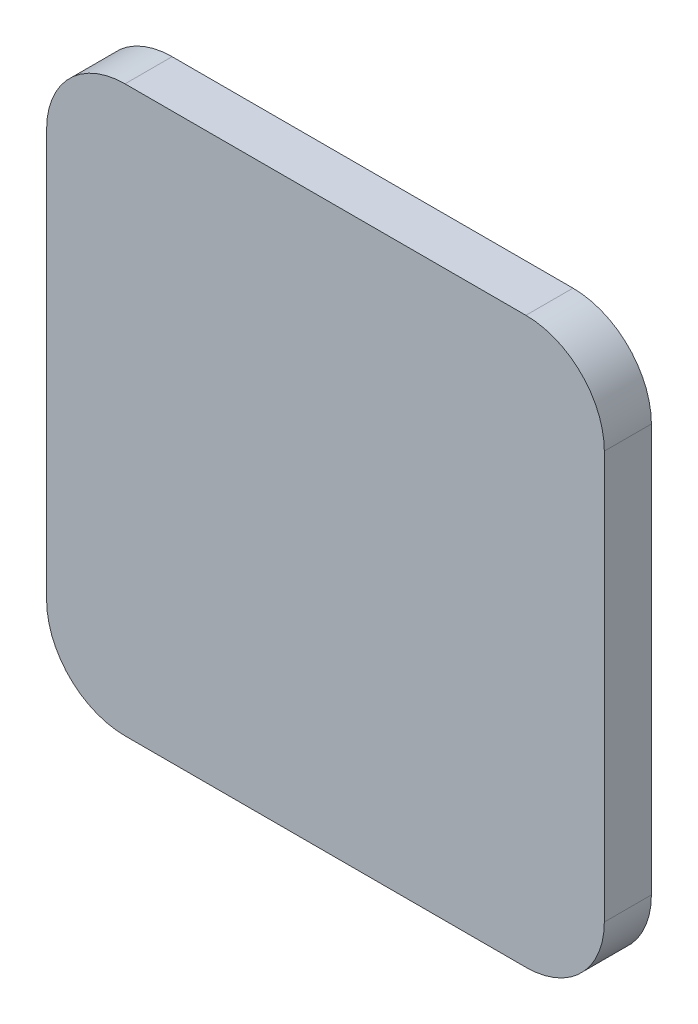
ISO-10303-21;
HEADER;
FILE_DESCRIPTION(('STEP AP214'),'2;1');
FILE_NAME('part.step','',(''),(''),'','','');
FILE_SCHEMA(('AUTOMOTIVE_DESIGN { 1 0 10303 214 1 1 1 1 }'));
ENDSEC;
DATA;
#1=APPLICATION_CONTEXT('core data for automotive mechanical design processes');
#2=APPLICATION_PROTOCOL_DEFINITION('international standard','automotive_design',2000,#1);
#3=PRODUCT_CONTEXT('',#1,'mechanical');
#4=PRODUCT('Part','Part','',(#3));
#5=PRODUCT_RELATED_PRODUCT_CATEGORY('part','',(#4));
#6=PRODUCT_DEFINITION_FORMATION('','',#4);
#7=PRODUCT_DEFINITION_CONTEXT('part definition',#1,'design');
#8=PRODUCT_DEFINITION('design','',#6,#7);
#9=PRODUCT_DEFINITION_SHAPE('','',#8);
#10=(LENGTH_UNIT() NAMED_UNIT(*) SI_UNIT(.MILLI.,.METRE.));
#11=(NAMED_UNIT(*) PLANE_ANGLE_UNIT() SI_UNIT($,.RADIAN.));
#12=(NAMED_UNIT(*) SI_UNIT($,.STERADIAN.) SOLID_ANGLE_UNIT());
#13=UNCERTAINTY_MEASURE_WITH_UNIT(LENGTH_MEASURE(1.E-05),#10,'distance_accuracy_value','');
#14=(GEOMETRIC_REPRESENTATION_CONTEXT(3) GLOBAL_UNCERTAINTY_ASSIGNED_CONTEXT((#13)) GLOBAL_UNIT_ASSIGNED_CONTEXT((#10,
#11,#12)) REPRESENTATION_CONTEXT('',''));
#15=CARTESIAN_POINT('',(0.,0.,0.));
#16=DIRECTION('',(0.,0.,1.));
#17=DIRECTION('',(1.,0.,0.));
#18=AXIS2_PLACEMENT_3D('',#15,#16,#17);
#19=CARTESIAN_POINT('',(13.,-13.,9.));
#20=DIRECTION('',(0.,0.,-1.));
#21=DIRECTION('',(-1.,0.,0.));
#22=AXIS2_PLACEMENT_3D('',#19,#20,#21);
#23=CYLINDRICAL_SURFACE('',#22,5.);
#24=CARTESIAN_POINT('',(13.,-13.,6.));
#25=DIRECTION('',(0.,0.,1.));
#26=DIRECTION('',(-1.,0.,0.));
#27=AXIS2_PLACEMENT_3D('',#24,#25,#26);
#28=CIRCLE('',#27,5.);
#29=CARTESIAN_POINT('',(13.,-18.,6.));
#30=VERTEX_POINT('',#29);
#31=CARTESIAN_POINT('',(18.,-13.,6.));
#32=VERTEX_POINT('',#31);
#33=EDGE_CURVE('E130',#30,#32,#28,.T.);
#34=ORIENTED_EDGE('',*,*,#33,.T.);
#35=DIRECTION('',(0.,0.,-1.));
#36=VECTOR('',#35,1.);
#37=CARTESIAN_POINT('',(18.,-13.,9.));
#38=LINE('',#37,#36);
#39=CARTESIAN_POINT('',(18.,-13.,9.));
#40=VERTEX_POINT('',#39);
#41=EDGE_CURVE('E11',#40,#32,#38,.T.);
#42=ORIENTED_EDGE('',*,*,#41,.F.);
#43=CARTESIAN_POINT('',(13.,-13.,9.));
#44=DIRECTION('',(0.,0.,1.));
#45=DIRECTION('',(-1.,0.,0.));
#46=AXIS2_PLACEMENT_3D('',#43,#44,#45);
#47=CIRCLE('',#46,5.);
#48=CARTESIAN_POINT('',(13.,-18.,9.));
#49=VERTEX_POINT('',#48);
#50=EDGE_CURVE('E144',#49,#40,#47,.T.);
#51=ORIENTED_EDGE('',*,*,#50,.F.);
#52=DIRECTION('',(0.,0.,-1.));
#53=VECTOR('',#52,1.);
#54=CARTESIAN_POINT('',(13.,-18.,9.));
#55=LINE('',#54,#53);
#56=EDGE_CURVE('E126',#49,#30,#55,.T.);
#57=ORIENTED_EDGE('',*,*,#56,.T.);
#58=EDGE_LOOP('',(#34,#42,#51,#57));
#59=FACE_BOUND('',#58,.T.);
#60=ADVANCED_FACE('F34',(#59),#23,.T.);
#61=CARTESIAN_POINT('',(18.,13.,9.));
#62=DIRECTION('',(-1.,0.,0.));
#63=DIRECTION('',(0.,-1.,0.));
#64=AXIS2_PLACEMENT_3D('',#61,#62,#63);
#65=PLANE('',#64);
#66=DIRECTION('',(0.,1.,0.));
#67=VECTOR('',#66,1.);
#68=CARTESIAN_POINT('',(18.,13.,6.));
#69=LINE('',#68,#67);
#70=CARTESIAN_POINT('',(18.,13.,6.));
#71=VERTEX_POINT('',#70);
#72=EDGE_CURVE('E133',#32,#71,#69,.T.);
#73=ORIENTED_EDGE('',*,*,#72,.T.);
#74=DIRECTION('',(0.,0.,-1.));
#75=VECTOR('',#74,1.);
#76=CARTESIAN_POINT('',(18.,13.,9.));
#77=LINE('',#76,#75);
#78=CARTESIAN_POINT('',(18.,13.,9.));
#79=VERTEX_POINT('',#78);
#80=EDGE_CURVE('E42',#79,#71,#77,.T.);
#81=ORIENTED_EDGE('',*,*,#80,.F.);
#82=DIRECTION('',(0.,1.,0.));
#83=VECTOR('',#82,1.);
#84=CARTESIAN_POINT('',(18.,13.,9.));
#85=LINE('',#84,#83);
#86=EDGE_CURVE('E93',#40,#79,#85,.T.);
#87=ORIENTED_EDGE('',*,*,#86,.F.);
#88=ORIENTED_EDGE('',*,*,#41,.T.);
#89=EDGE_LOOP('',(#73,#81,#87,#88));
#90=FACE_BOUND('',#89,.T.);
#91=ADVANCED_FACE('F179',(#90),#65,.F.);
#92=CARTESIAN_POINT('',(13.,13.,9.));
#93=DIRECTION('',(0.,0.,-1.));
#94=DIRECTION('',(-1.,0.,0.));
#95=AXIS2_PLACEMENT_3D('',#92,#93,#94);
#96=CYLINDRICAL_SURFACE('',#95,5.);
#97=CARTESIAN_POINT('',(13.,13.,6.));
#98=DIRECTION('',(0.,0.,1.));
#99=DIRECTION('',(-1.,0.,0.));
#100=AXIS2_PLACEMENT_3D('',#97,#98,#99);
#101=CIRCLE('',#100,5.);
#102=CARTESIAN_POINT('',(13.,18.,6.));
#103=VERTEX_POINT('',#102);
#104=EDGE_CURVE('E135',#71,#103,#101,.T.);
#105=ORIENTED_EDGE('',*,*,#104,.T.);
#106=DIRECTION('',(0.,0.,-1.));
#107=VECTOR('',#106,1.);
#108=CARTESIAN_POINT('',(13.,18.,9.));
#109=LINE('',#108,#107);
#110=CARTESIAN_POINT('',(13.,18.,9.));
#111=VERTEX_POINT('',#110);
#112=EDGE_CURVE('E151',#111,#103,#109,.T.);
#113=ORIENTED_EDGE('',*,*,#112,.F.);
#114=CARTESIAN_POINT('',(13.,13.,9.));
#115=DIRECTION('',(0.,0.,1.));
#116=DIRECTION('',(-1.,0.,0.));
#117=AXIS2_PLACEMENT_3D('',#114,#115,#116);
#118=CIRCLE('',#117,5.);
#119=EDGE_CURVE('E159',#79,#111,#118,.T.);
#120=ORIENTED_EDGE('',*,*,#119,.F.);
#121=ORIENTED_EDGE('',*,*,#80,.T.);
#122=EDGE_LOOP('',(#105,#113,#120,#121));
#123=FACE_BOUND('',#122,.T.);
#124=ADVANCED_FACE('F157',(#123),#96,.T.);
#125=CARTESIAN_POINT('',(-12.5570972809424,18.,9.));
#126=DIRECTION('',(0.,-1.,0.));
#127=DIRECTION('',(0.,0.,-1.));
#128=AXIS2_PLACEMENT_3D('',#125,#126,#127);
#129=PLANE('',#128);
#130=DIRECTION('',(-1.,0.,0.));
#131=VECTOR('',#130,1.);
#132=CARTESIAN_POINT('',(-12.5570972809424,18.,6.));
#133=LINE('',#132,#131);
#134=CARTESIAN_POINT('',(-12.5570972809424,18.,6.));
#135=VERTEX_POINT('',#134);
#136=EDGE_CURVE('E137',#103,#135,#133,.T.);
#137=ORIENTED_EDGE('',*,*,#136,.T.);
#138=DIRECTION('',(0.,0.,-1.));
#139=VECTOR('',#138,1.);
#140=CARTESIAN_POINT('',(-12.5570972809424,18.,9.));
#141=LINE('',#140,#139);
#142=CARTESIAN_POINT('',(-12.5570972809424,18.,9.));
#143=VERTEX_POINT('',#142);
#144=EDGE_CURVE('E148',#143,#135,#141,.T.);
#145=ORIENTED_EDGE('',*,*,#144,.F.);
#146=DIRECTION('',(-1.,0.,0.));
#147=VECTOR('',#146,1.);
#148=CARTESIAN_POINT('',(-12.5570972809424,18.,9.));
#149=LINE('',#148,#147);
#150=EDGE_CURVE('E171',#111,#143,#149,.T.);
#151=ORIENTED_EDGE('',*,*,#150,.F.);
#152=ORIENTED_EDGE('',*,*,#112,.T.);
#153=EDGE_LOOP('',(#137,#145,#151,#152));
#154=FACE_BOUND('',#153,.T.);
#155=ADVANCED_FACE('F167',(#154),#129,.F.);
#156=CARTESIAN_POINT('',(-12.5570972809425,13.,9.));
#157=DIRECTION('',(0.,0.,-1.));
#158=DIRECTION('',(-1.,0.,0.));
#159=AXIS2_PLACEMENT_3D('',#156,#157,#158);
#160=CYLINDRICAL_SURFACE('',#159,5.);
#161=CARTESIAN_POINT('',(-12.5570972809425,13.,6.));
#162=DIRECTION('',(0.,0.,1.));
#163=DIRECTION('',(-1.,0.,0.));
#164=AXIS2_PLACEMENT_3D('',#161,#162,#163);
#165=CIRCLE('',#164,5.);
#166=CARTESIAN_POINT('',(-17.5570972809425,13.,6.));
#167=VERTEX_POINT('',#166);
#168=EDGE_CURVE('E139',#135,#167,#165,.T.);
#169=ORIENTED_EDGE('',*,*,#168,.T.);
#170=DIRECTION('',(0.,0.,-1.));
#171=VECTOR('',#170,1.);
#172=CARTESIAN_POINT('',(-17.5570972809425,13.,9.));
#173=LINE('',#172,#171);
#174=CARTESIAN_POINT('',(-17.5570972809425,13.,9.));
#175=VERTEX_POINT('',#174);
#176=EDGE_CURVE('E121',#175,#167,#173,.T.);
#177=ORIENTED_EDGE('',*,*,#176,.F.);
#178=CARTESIAN_POINT('',(-12.5570972809425,13.,9.));
#179=DIRECTION('',(0.,0.,1.));
#180=DIRECTION('',(-1.,0.,0.));
#181=AXIS2_PLACEMENT_3D('',#178,#179,#180);
#182=CIRCLE('',#181,5.);
#183=EDGE_CURVE('E112',#143,#175,#182,.T.);
#184=ORIENTED_EDGE('',*,*,#183,.F.);
#185=ORIENTED_EDGE('',*,*,#144,.T.);
#186=EDGE_LOOP('',(#169,#177,#184,#185));
#187=FACE_BOUND('',#186,.T.);
#188=ADVANCED_FACE('F170',(#187),#160,.T.);
#189=CARTESIAN_POINT('',(-17.5570972809425,13.,9.));
#190=DIRECTION('',(1.,0.,0.));
#191=DIRECTION('',(0.,1.,0.));
#192=AXIS2_PLACEMENT_3D('',#189,#190,#191);
#193=PLANE('',#192);
#194=DIRECTION('',(0.,-1.,0.));
#195=VECTOR('',#194,1.);
#196=CARTESIAN_POINT('',(-17.5570972809425,13.,6.));
#197=LINE('',#196,#195);
#198=CARTESIAN_POINT('',(-17.5570972809425,-13.,6.));
#199=VERTEX_POINT('',#198);
#200=EDGE_CURVE('E120',#167,#199,#197,.T.);
#201=ORIENTED_EDGE('',*,*,#200,.T.);
#202=DIRECTION('',(0.,0.,-1.));
#203=VECTOR('',#202,1.);
#204=CARTESIAN_POINT('',(-17.5570972809425,-13.,9.));
#205=LINE('',#204,#203);
#206=CARTESIAN_POINT('',(-17.5570972809425,-13.,9.));
#207=VERTEX_POINT('',#206);
#208=EDGE_CURVE('E117',#207,#199,#205,.T.);
#209=ORIENTED_EDGE('',*,*,#208,.F.);
#210=DIRECTION('',(0.,-1.,0.));
#211=VECTOR('',#210,1.);
#212=CARTESIAN_POINT('',(-17.5570972809425,13.,9.));
#213=LINE('',#212,#211);
#214=EDGE_CURVE('E106',#175,#207,#213,.T.);
#215=ORIENTED_EDGE('',*,*,#214,.F.);
#216=ORIENTED_EDGE('',*,*,#176,.T.);
#217=EDGE_LOOP('',(#201,#209,#215,#216));
#218=FACE_BOUND('',#217,.T.);
#219=ADVANCED_FACE('F118',(#218),#193,.F.);
#220=CARTESIAN_POINT('',(-12.5570972809425,-13.,9.));
#221=DIRECTION('',(0.,0.,-1.));
#222=DIRECTION('',(-1.,0.,0.));
#223=AXIS2_PLACEMENT_3D('',#220,#221,#222);
#224=CYLINDRICAL_SURFACE('',#223,5.);
#225=CARTESIAN_POINT('',(-12.5570972809425,-13.,6.));
#226=DIRECTION('',(0.,0.,1.));
#227=DIRECTION('',(-1.,0.,0.));
#228=AXIS2_PLACEMENT_3D('',#225,#226,#227);
#229=CIRCLE('',#228,5.);
#230=CARTESIAN_POINT('',(-12.5570972809424,-18.,6.));
#231=VERTEX_POINT('',#230);
#232=EDGE_CURVE('E79',#199,#231,#229,.T.);
#233=ORIENTED_EDGE('',*,*,#232,.T.);
#234=DIRECTION('',(0.,0.,-1.));
#235=VECTOR('',#234,1.);
#236=CARTESIAN_POINT('',(-12.5570972809424,-18.,9.));
#237=LINE('',#236,#235);
#238=CARTESIAN_POINT('',(-12.5570972809424,-18.,9.));
#239=VERTEX_POINT('',#238);
#240=EDGE_CURVE('E122',#239,#231,#237,.T.);
#241=ORIENTED_EDGE('',*,*,#240,.F.);
#242=CARTESIAN_POINT('',(-12.5570972809425,-13.,9.));
#243=DIRECTION('',(0.,0.,1.));
#244=DIRECTION('',(-1.,0.,0.));
#245=AXIS2_PLACEMENT_3D('',#242,#243,#244);
#246=CIRCLE('',#245,5.);
#247=EDGE_CURVE('E110',#207,#239,#246,.T.);
#248=ORIENTED_EDGE('',*,*,#247,.F.);
#249=ORIENTED_EDGE('',*,*,#208,.T.);
#250=EDGE_LOOP('',(#233,#241,#248,#249));
#251=FACE_BOUND('',#250,.T.);
#252=ADVANCED_FACE('F124',(#251),#224,.T.);
#253=CARTESIAN_POINT('',(-12.5570972809424,-18.,9.));
#254=DIRECTION('',(0.,1.,0.));
#255=DIRECTION('',(0.,0.,1.));
#256=AXIS2_PLACEMENT_3D('',#253,#254,#255);
#257=PLANE('',#256);
#258=DIRECTION('',(1.,0.,0.));
#259=VECTOR('',#258,1.);
#260=CARTESIAN_POINT('',(-12.5570972809424,-18.,6.));
#261=LINE('',#260,#259);
#262=EDGE_CURVE('E85',#231,#30,#261,.T.);
#263=ORIENTED_EDGE('',*,*,#262,.T.);
#264=ORIENTED_EDGE('',*,*,#56,.F.);
#265=DIRECTION('',(1.,0.,0.));
#266=VECTOR('',#265,1.);
#267=CARTESIAN_POINT('',(-12.5570972809424,-18.,9.));
#268=LINE('',#267,#266);
#269=EDGE_CURVE('E50',#239,#49,#268,.T.);
#270=ORIENTED_EDGE('',*,*,#269,.F.);
#271=ORIENTED_EDGE('',*,*,#240,.T.);
#272=EDGE_LOOP('',(#263,#264,#270,#271));
#273=FACE_BOUND('',#272,.T.);
#274=ADVANCED_FACE('F195',(#273),#257,.F.);
#275=CARTESIAN_POINT('',(13.,-13.,9.));
#276=DIRECTION('',(0.,0.,-1.));
#277=DIRECTION('',(-1.,0.,0.));
#278=AXIS2_PLACEMENT_3D('',#275,#276,#277);
#279=PLANE('',#278);
#280=ORIENTED_EDGE('',*,*,#50,.T.);
#281=ORIENTED_EDGE('',*,*,#86,.T.);
#282=ORIENTED_EDGE('',*,*,#119,.T.);
#283=ORIENTED_EDGE('',*,*,#150,.T.);
#284=ORIENTED_EDGE('',*,*,#183,.T.);
#285=ORIENTED_EDGE('',*,*,#214,.T.);
#286=ORIENTED_EDGE('',*,*,#247,.T.);
#287=ORIENTED_EDGE('',*,*,#269,.T.);
#288=EDGE_LOOP('',(#280,#281,#282,#283,#284,#285,#286,#287));
#289=FACE_BOUND('',#288,.T.);
#290=ADVANCED_FACE('F108',(#289),#279,.F.);
#291=CARTESIAN_POINT('',(13.,-13.,6.));
#292=DIRECTION('',(0.,0.,-1.));
#293=DIRECTION('',(-1.,0.,0.));
#294=AXIS2_PLACEMENT_3D('',#291,#292,#293);
#295=PLANE('',#294);
#296=ORIENTED_EDGE('',*,*,#33,.F.);
#297=ORIENTED_EDGE('',*,*,#262,.F.);
#298=ORIENTED_EDGE('',*,*,#232,.F.);
#299=ORIENTED_EDGE('',*,*,#200,.F.);
#300=ORIENTED_EDGE('',*,*,#168,.F.);
#301=ORIENTED_EDGE('',*,*,#136,.F.);
#302=ORIENTED_EDGE('',*,*,#104,.F.);
#303=ORIENTED_EDGE('',*,*,#72,.F.);
#304=EDGE_LOOP('',(#296,#297,#298,#299,#300,#301,#302,#303));
#305=FACE_BOUND('',#304,.T.);
#306=ADVANCED_FACE('F163',(#305),#295,.T.);
#307=CLOSED_SHELL('',(#60,#91,#124,#155,#188,#219,#252,#274,#290,#306));
#308=MANIFOLD_SOLID_BREP('B2',#307);
#309=ADVANCED_BREP_SHAPE_REPRESENTATION('',(#18,#308),#14);
#310=SHAPE_DEFINITION_REPRESENTATION(#9,#309);
ENDSEC;
END-ISO-10303-21;
